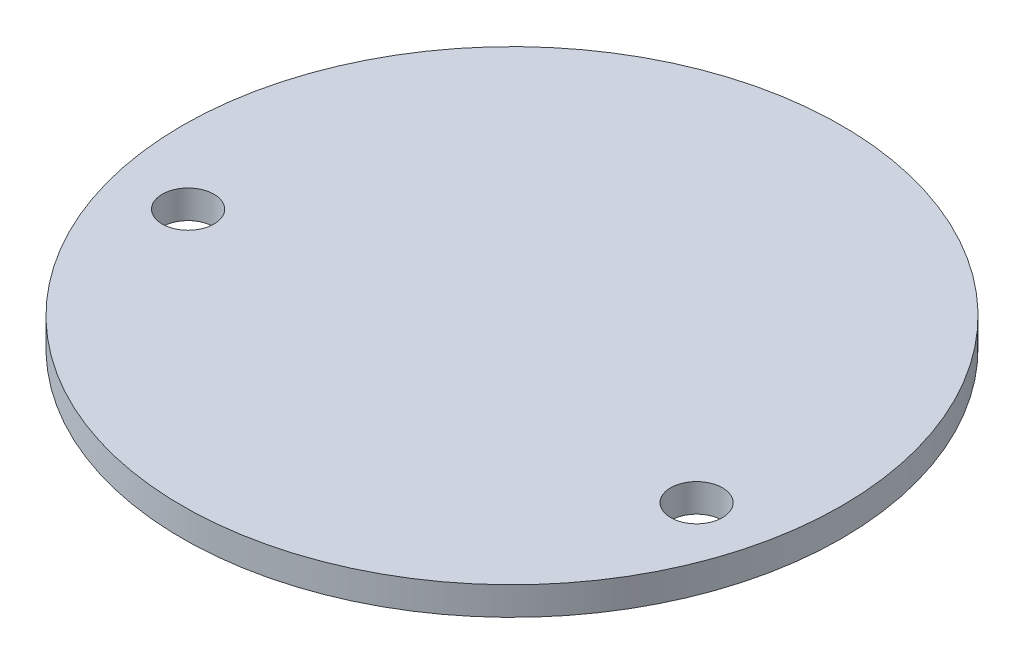
ISO-10303-21;
HEADER;
FILE_DESCRIPTION(('STEP AP214'),'2;1');
FILE_NAME('part.step','',(''),(''),'','','');
FILE_SCHEMA(('AUTOMOTIVE_DESIGN { 1 0 10303 214 1 1 1 1 }'));
ENDSEC;
DATA;
#1=APPLICATION_CONTEXT('core data for automotive mechanical design processes');
#2=APPLICATION_PROTOCOL_DEFINITION('international standard','automotive_design',2000,#1);
#3=PRODUCT_CONTEXT('',#1,'mechanical');
#4=PRODUCT('Part','Part','',(#3));
#5=PRODUCT_RELATED_PRODUCT_CATEGORY('part','',(#4));
#6=PRODUCT_DEFINITION_FORMATION('','',#4);
#7=PRODUCT_DEFINITION_CONTEXT('part definition',#1,'design');
#8=PRODUCT_DEFINITION('design','',#6,#7);
#9=PRODUCT_DEFINITION_SHAPE('','',#8);
#10=(LENGTH_UNIT() NAMED_UNIT(*) SI_UNIT(.MILLI.,.METRE.));
#11=(NAMED_UNIT(*) PLANE_ANGLE_UNIT() SI_UNIT($,.RADIAN.));
#12=(NAMED_UNIT(*) SI_UNIT($,.STERADIAN.) SOLID_ANGLE_UNIT());
#13=UNCERTAINTY_MEASURE_WITH_UNIT(LENGTH_MEASURE(1.E-05),#10,'distance_accuracy_value','');
#14=(GEOMETRIC_REPRESENTATION_CONTEXT(3) GLOBAL_UNCERTAINTY_ASSIGNED_CONTEXT((#13)) GLOBAL_UNIT_ASSIGNED_CONTEXT((#10,
#11,#12)) REPRESENTATION_CONTEXT('',''));
#15=CARTESIAN_POINT('',(0.,0.,0.));
#16=DIRECTION('',(0.,0.,1.));
#17=DIRECTION('',(1.,0.,0.));
#18=AXIS2_PLACEMENT_3D('',#15,#16,#17);
#19=CARTESIAN_POINT('',(0.,0.,0.));
#20=DIRECTION('',(0.,-1.,0.));
#21=DIRECTION('',(1.,0.,0.));
#22=AXIS2_PLACEMENT_3D('',#19,#20,#21);
#23=PLANE('',#22);
#24=CARTESIAN_POINT('',(-27.,-1.52646136765302E-13,7.4));
#25=DIRECTION('',(0.,-1.,0.));
#26=DIRECTION('',(1.,0.,0.));
#27=AXIS2_PLACEMENT_3D('',#24,#25,#26);
#28=CIRCLE('',#27,2.75);
#29=CARTESIAN_POINT('',(-29.75,-1.62079330940637E-13,7.4));
#30=VERTEX_POINT('',#29);
#31=EDGE_CURVE('E58',#30,#30,#28,.F.);
#32=ORIENTED_EDGE('',*,*,#31,.T.);
#33=EDGE_LOOP('',(#32));
#34=FACE_BOUND('',#33,.T.);
#35=CARTESIAN_POINT('',(27.,0.,7.4));
#36=DIRECTION('',(0.,-1.,0.));
#37=DIRECTION('',(1.,0.,0.));
#38=AXIS2_PLACEMENT_3D('',#35,#36,#37);
#39=CIRCLE('',#38,2.75);
#40=CARTESIAN_POINT('',(24.25,0.,7.4));
#41=VERTEX_POINT('',#40);
#42=EDGE_CURVE('E65',#41,#41,#39,.F.);
#43=ORIENTED_EDGE('',*,*,#42,.T.);
#44=EDGE_LOOP('',(#43));
#45=FACE_BOUND('',#44,.T.);
#46=CARTESIAN_POINT('',(0.,-1.11022302462516E-13,0.));
#47=DIRECTION('',(0.,-1.,0.));
#48=DIRECTION('',(1.,0.,0.));
#49=AXIS2_PLACEMENT_3D('',#46,#47,#48);
#50=CIRCLE('',#49,35.);
#51=CARTESIAN_POINT('',(35.,0.,0.));
#52=VERTEX_POINT('',#51);
#53=EDGE_CURVE('E10',#52,#52,#50,.T.);
#54=ORIENTED_EDGE('',*,*,#53,.T.);
#55=EDGE_LOOP('',(#54));
#56=FACE_BOUND('',#55,.T.);
#57=ADVANCED_FACE('F41',(#34,#45,#56),#23,.T.);
#58=CARTESIAN_POINT('',(1.43079862251878E-12,-417.112175525316,0.));
#59=DIRECTION('',(0.,-1.,0.));
#60=DIRECTION('',(1.,0.,0.));
#61=AXIS2_PLACEMENT_3D('',#58,#59,#60);
#62=CYLINDRICAL_SURFACE('',#61,35.);
#63=CARTESIAN_POINT('',(0.,2.99999999999989,0.));
#64=DIRECTION('',(0.,-1.,0.));
#65=DIRECTION('',(1.,0.,0.));
#66=AXIS2_PLACEMENT_3D('',#63,#64,#65);
#67=CIRCLE('',#66,35.);
#68=CARTESIAN_POINT('',(35.,3.00000000000001,0.));
#69=VERTEX_POINT('',#68);
#70=EDGE_CURVE('E48',#69,#69,#67,.T.);
#71=ORIENTED_EDGE('',*,*,#70,.T.);
#72=EDGE_LOOP('',(#71));
#73=FACE_BOUND('',#72,.T.);
#74=ORIENTED_EDGE('',*,*,#53,.F.);
#75=EDGE_LOOP('',(#74));
#76=FACE_BOUND('',#75,.T.);
#77=ADVANCED_FACE('F85',(#73,#76),#62,.T.);
#78=CARTESIAN_POINT('',(35.,3.00000000000006,0.));
#79=DIRECTION('',(0.,1.,0.));
#80=DIRECTION('',(-1.,0.,0.));
#81=AXIS2_PLACEMENT_3D('',#78,#79,#80);
#82=PLANE('',#81);
#83=CARTESIAN_POINT('',(-27.,2.99999999999985,7.4));
#84=DIRECTION('',(0.,1.,0.));
#85=DIRECTION('',(-1.,0.,0.));
#86=AXIS2_PLACEMENT_3D('',#83,#84,#85);
#87=CIRCLE('',#86,2.75);
#88=CARTESIAN_POINT('',(-29.75,2.99999999999984,7.4));
#89=VERTEX_POINT('',#88);
#90=EDGE_CURVE('E53',#89,#89,#87,.T.);
#91=ORIENTED_EDGE('',*,*,#90,.F.);
#92=EDGE_LOOP('',(#91));
#93=FACE_BOUND('',#92,.T.);
#94=CARTESIAN_POINT('',(27.,3.00000000000003,7.4));
#95=DIRECTION('',(0.,1.,0.));
#96=DIRECTION('',(-1.,0.,0.));
#97=AXIS2_PLACEMENT_3D('',#94,#95,#96);
#98=CIRCLE('',#97,2.75);
#99=CARTESIAN_POINT('',(24.25,3.00000000000002,7.4));
#100=VERTEX_POINT('',#99);
#101=EDGE_CURVE('E61',#100,#100,#98,.T.);
#102=ORIENTED_EDGE('',*,*,#101,.F.);
#103=EDGE_LOOP('',(#102));
#104=FACE_BOUND('',#103,.T.);
#105=ORIENTED_EDGE('',*,*,#70,.F.);
#106=EDGE_LOOP('',(#105));
#107=FACE_BOUND('',#106,.T.);
#108=ADVANCED_FACE('F82',(#93,#104,#107),#82,.T.);
#109=CARTESIAN_POINT('',(27.,-0.00100000000001791,7.4));
#110=DIRECTION('',(0.,1.,0.));
#111=DIRECTION('',(-1.,0.,0.));
#112=AXIS2_PLACEMENT_3D('',#109,#110,#111);
#113=CYLINDRICAL_SURFACE('',#112,2.75);
#114=CARTESIAN_POINT('',(24.25,0.,7.4));
#115=CARTESIAN_POINT('',(24.25,0.0312500000000231,7.4));
#116=CARTESIAN_POINT('',(24.25,0.0625000000000231,7.4));
#117=CARTESIAN_POINT('',(24.25,0.125000000000023,7.4));
#118=CARTESIAN_POINT('',(24.25,0.156250000000023,7.4));
#119=CARTESIAN_POINT('',(24.25,0.218750000000023,7.4));
#120=CARTESIAN_POINT('',(24.25,0.250000000000023,7.4));
#121=CARTESIAN_POINT('',(24.25,0.312500000000023,7.4));
#122=CARTESIAN_POINT('',(24.25,0.343750000000023,7.4));
#123=CARTESIAN_POINT('',(24.25,0.406250000000023,7.4));
#124=CARTESIAN_POINT('',(24.25,0.437500000000023,7.4));
#125=CARTESIAN_POINT('',(24.25,0.500000000000023,7.4));
#126=CARTESIAN_POINT('',(24.25,0.531250000000023,7.4));
#127=CARTESIAN_POINT('',(24.25,0.593750000000023,7.4));
#128=CARTESIAN_POINT('',(24.25,0.625000000000023,7.4));
#129=CARTESIAN_POINT('',(24.25,0.687500000000023,7.4));
#130=CARTESIAN_POINT('',(24.25,0.718750000000023,7.4));
#131=CARTESIAN_POINT('',(24.25,0.781250000000023,7.4));
#132=CARTESIAN_POINT('',(24.25,0.812500000000023,7.4));
#133=CARTESIAN_POINT('',(24.25,0.875000000000023,7.4));
#134=CARTESIAN_POINT('',(24.25,0.906250000000023,7.4));
#135=CARTESIAN_POINT('',(24.25,0.968750000000022,7.4));
#136=CARTESIAN_POINT('',(24.25,1.00000000000002,7.4));
#137=CARTESIAN_POINT('',(24.25,1.06250000000002,7.4));
#138=CARTESIAN_POINT('',(24.25,1.09375000000002,7.4));
#139=CARTESIAN_POINT('',(24.25,1.15625000000002,7.4));
#140=CARTESIAN_POINT('',(24.25,1.18750000000002,7.4));
#141=CARTESIAN_POINT('',(24.25,1.25000000000002,7.4));
#142=CARTESIAN_POINT('',(24.25,1.28125000000002,7.4));
#143=CARTESIAN_POINT('',(24.25,1.34375000000002,7.4));
#144=CARTESIAN_POINT('',(24.25,1.37500000000002,7.4));
#145=CARTESIAN_POINT('',(24.25,1.43750000000002,7.4));
#146=CARTESIAN_POINT('',(24.25,1.46875000000002,7.4));
#147=CARTESIAN_POINT('',(24.25,1.53125000000002,7.4));
#148=CARTESIAN_POINT('',(24.25,1.56250000000002,7.4));
#149=CARTESIAN_POINT('',(24.25,1.62500000000002,7.4));
#150=CARTESIAN_POINT('',(24.25,1.65625000000002,7.4));
#151=CARTESIAN_POINT('',(24.25,1.71875000000002,7.4));
#152=CARTESIAN_POINT('',(24.25,1.75000000000002,7.4));
#153=CARTESIAN_POINT('',(24.25,1.81250000000002,7.4));
#154=CARTESIAN_POINT('',(24.25,1.84375000000002,7.4));
#155=CARTESIAN_POINT('',(24.25,1.90625000000002,7.4));
#156=CARTESIAN_POINT('',(24.25,1.93750000000002,7.4));
#157=CARTESIAN_POINT('',(24.25,2.00000000000002,7.4));
#158=CARTESIAN_POINT('',(24.25,2.03125000000002,7.4));
#159=CARTESIAN_POINT('',(24.25,2.09375000000002,7.4));
#160=CARTESIAN_POINT('',(24.25,2.12500000000002,7.4));
#161=CARTESIAN_POINT('',(24.25,2.18750000000002,7.4));
#162=CARTESIAN_POINT('',(24.25,2.21875000000002,7.4));
#163=CARTESIAN_POINT('',(24.25,2.28125000000002,7.4));
#164=CARTESIAN_POINT('',(24.25,2.31250000000002,7.4));
#165=CARTESIAN_POINT('',(24.25,2.37500000000002,7.4));
#166=CARTESIAN_POINT('',(24.25,2.40625000000002,7.4));
#167=CARTESIAN_POINT('',(24.25,2.46875000000002,7.4));
#168=CARTESIAN_POINT('',(24.25,2.50000000000002,7.4));
#169=CARTESIAN_POINT('',(24.25,2.56250000000002,7.4));
#170=CARTESIAN_POINT('',(24.25,2.59375000000002,7.4));
#171=CARTESIAN_POINT('',(24.25,2.65625000000002,7.4));
#172=CARTESIAN_POINT('',(24.25,2.68750000000002,7.4));
#173=CARTESIAN_POINT('',(24.25,2.75000000000002,7.4));
#174=CARTESIAN_POINT('',(24.25,2.78125000000002,7.4));
#175=CARTESIAN_POINT('',(24.25,2.84375000000002,7.4));
#176=CARTESIAN_POINT('',(24.25,2.87500000000002,7.4));
#177=CARTESIAN_POINT('',(24.25,2.93750000000002,7.4));
#178=CARTESIAN_POINT('',(24.25,2.96875000000002,7.4));
#179=CARTESIAN_POINT('',(24.25,3.00000000000002,7.4));
#180=B_SPLINE_CURVE_WITH_KNOTS('',3,(#114,#115,#116,#117,#118,#119,#120,#121,#122,#123,#124,
#125,#126,#127,#128,#129,#130,#131,#132,#133,#134,#135,#136,#137,#138,#139,#140,#141,#142,#143,
#144,#145,#146,#147,#148,#149,#150,#151,#152,#153,#154,#155,#156,#157,#158,#159,#160,#161,#162,
#163,#164,#165,#166,#167,#168,#169,#170,#171,#172,#173,#174,#175,#176,#177,#178,#179),
.UNSPECIFIED.,.F.,.F.,(4,2,2,2,2,2,2,2,2,2,2,2,2,2,2,2,2,2,2,2,2,2,2,2,2,2,2,2,2,2,2,2,4),(0.,
0.0937499999999999,0.1875,0.28125,0.375,0.46875,0.5625,0.65625,0.75,0.84375,0.9375,1.03125,
1.125,1.21875,1.3125,1.40625,1.5,1.59375,1.6875,1.78125,1.875,1.96875,2.0625,2.15625,2.25,
2.34375,2.4375,2.53125,2.625,2.71875,2.8125,2.90625,3.),.UNSPECIFIED.);
#181=EDGE_CURVE('BSEAM78',#41,#100,#180,.T.);
#182=ORIENTED_EDGE('',*,*,#42,.F.);
#183=ORIENTED_EDGE('',*,*,#101,.T.);
#184=ORIENTED_EDGE('',*,*,#181,.T.);
#185=ORIENTED_EDGE('',*,*,#181,.F.);
#186=EDGE_LOOP('',(#182,#184,#183,#185));
#187=FACE_BOUND('',#186,.T.);
#188=ADVANCED_FACE('F78',(#187),#113,.F.);
#189=CARTESIAN_POINT('',(-27.,-0.00100000000020353,7.4));
#190=DIRECTION('',(0.,1.,0.));
#191=DIRECTION('',(-1.,0.,0.));
#192=AXIS2_PLACEMENT_3D('',#189,#190,#191);
#193=CYLINDRICAL_SURFACE('',#192,2.75);
#194=CARTESIAN_POINT('',(-29.75,-1.62079330940637E-13,7.4));
#195=CARTESIAN_POINT('',(-29.75,0.0312499999998379,7.4));
#196=CARTESIAN_POINT('',(-29.75,0.0624999999998379,7.4));
#197=CARTESIAN_POINT('',(-29.75,0.124999999999838,7.4));
#198=CARTESIAN_POINT('',(-29.75,0.156249999999838,7.4));
#199=CARTESIAN_POINT('',(-29.75,0.218749999999838,7.4));
#200=CARTESIAN_POINT('',(-29.75,0.249999999999838,7.4));
#201=CARTESIAN_POINT('',(-29.75,0.312499999999838,7.4));
#202=CARTESIAN_POINT('',(-29.75,0.343749999999838,7.4));
#203=CARTESIAN_POINT('',(-29.75,0.406249999999838,7.4));
#204=CARTESIAN_POINT('',(-29.75,0.437499999999838,7.4));
#205=CARTESIAN_POINT('',(-29.75,0.499999999999837,7.4));
#206=CARTESIAN_POINT('',(-29.75,0.531249999999837,7.4));
#207=CARTESIAN_POINT('',(-29.75,0.593749999999837,7.4));
#208=CARTESIAN_POINT('',(-29.75,0.624999999999837,7.4));
#209=CARTESIAN_POINT('',(-29.75,0.687499999999837,7.4));
#210=CARTESIAN_POINT('',(-29.75,0.718749999999837,7.4));
#211=CARTESIAN_POINT('',(-29.75,0.781249999999837,7.4));
#212=CARTESIAN_POINT('',(-29.75,0.812499999999837,7.4));
#213=CARTESIAN_POINT('',(-29.75,0.874999999999837,7.4));
#214=CARTESIAN_POINT('',(-29.75,0.906249999999837,7.4));
#215=CARTESIAN_POINT('',(-29.75,0.968749999999837,7.4));
#216=CARTESIAN_POINT('',(-29.75,0.999999999999837,7.4));
#217=CARTESIAN_POINT('',(-29.75,1.06249999999984,7.4));
#218=CARTESIAN_POINT('',(-29.75,1.09374999999984,7.4));
#219=CARTESIAN_POINT('',(-29.75,1.15624999999984,7.4));
#220=CARTESIAN_POINT('',(-29.75,1.18749999999984,7.4));
#221=CARTESIAN_POINT('',(-29.75,1.24999999999984,7.4));
#222=CARTESIAN_POINT('',(-29.75,1.28124999999984,7.4));
#223=CARTESIAN_POINT('',(-29.75,1.34374999999984,7.4));
#224=CARTESIAN_POINT('',(-29.75,1.37499999999984,7.4));
#225=CARTESIAN_POINT('',(-29.75,1.43749999999984,7.4));
#226=CARTESIAN_POINT('',(-29.75,1.46874999999984,7.4));
#227=CARTESIAN_POINT('',(-29.75,1.53124999999984,7.4));
#228=CARTESIAN_POINT('',(-29.75,1.56249999999984,7.4));
#229=CARTESIAN_POINT('',(-29.75,1.62499999999984,7.4));
#230=CARTESIAN_POINT('',(-29.75,1.65624999999984,7.4));
#231=CARTESIAN_POINT('',(-29.75,1.71874999999984,7.4));
#232=CARTESIAN_POINT('',(-29.75,1.74999999999984,7.4));
#233=CARTESIAN_POINT('',(-29.75,1.81249999999984,7.4));
#234=CARTESIAN_POINT('',(-29.75,1.84374999999984,7.4));
#235=CARTESIAN_POINT('',(-29.75,1.90624999999984,7.4));
#236=CARTESIAN_POINT('',(-29.75,1.93749999999984,7.4));
#237=CARTESIAN_POINT('',(-29.75,1.99999999999984,7.4));
#238=CARTESIAN_POINT('',(-29.75,2.03124999999984,7.4));
#239=CARTESIAN_POINT('',(-29.75,2.09374999999984,7.4));
#240=CARTESIAN_POINT('',(-29.75,2.12499999999984,7.4));
#241=CARTESIAN_POINT('',(-29.75,2.18749999999984,7.4));
#242=CARTESIAN_POINT('',(-29.75,2.21874999999984,7.4));
#243=CARTESIAN_POINT('',(-29.75,2.28124999999984,7.4));
#244=CARTESIAN_POINT('',(-29.75,2.31249999999984,7.4));
#245=CARTESIAN_POINT('',(-29.75,2.37499999999984,7.4));
#246=CARTESIAN_POINT('',(-29.75,2.40624999999984,7.4));
#247=CARTESIAN_POINT('',(-29.75,2.46874999999984,7.4));
#248=CARTESIAN_POINT('',(-29.75,2.49999999999984,7.4));
#249=CARTESIAN_POINT('',(-29.75,2.56249999999984,7.4));
#250=CARTESIAN_POINT('',(-29.75,2.59374999999984,7.4));
#251=CARTESIAN_POINT('',(-29.75,2.65624999999984,7.4));
#252=CARTESIAN_POINT('',(-29.75,2.68749999999984,7.4));
#253=CARTESIAN_POINT('',(-29.75,2.74999999999984,7.4));
#254=CARTESIAN_POINT('',(-29.75,2.78124999999984,7.4));
#255=CARTESIAN_POINT('',(-29.75,2.84374999999984,7.4));
#256=CARTESIAN_POINT('',(-29.75,2.87499999999984,7.4));
#257=CARTESIAN_POINT('',(-29.75,2.93749999999984,7.4));
#258=CARTESIAN_POINT('',(-29.75,2.96874999999984,7.4));
#259=CARTESIAN_POINT('',(-29.75,2.99999999999984,7.4));
#260=B_SPLINE_CURVE_WITH_KNOTS('',3,(#194,#195,#196,#197,#198,#199,#200,#201,#202,#203,#204,
#205,#206,#207,#208,#209,#210,#211,#212,#213,#214,#215,#216,#217,#218,#219,#220,#221,#222,#223,
#224,#225,#226,#227,#228,#229,#230,#231,#232,#233,#234,#235,#236,#237,#238,#239,#240,#241,#242,
#243,#244,#245,#246,#247,#248,#249,#250,#251,#252,#253,#254,#255,#256,#257,#258,#259),
.UNSPECIFIED.,.F.,.F.,(4,2,2,2,2,2,2,2,2,2,2,2,2,2,2,2,2,2,2,2,2,2,2,2,2,2,2,2,2,2,2,2,4),(0.,
0.0937499999999999,0.1875,0.28125,0.375,0.46875,0.5625,0.656249999999999,0.749999999999999,
0.843749999999999,0.937499999999999,1.03125,1.125,1.21875,1.3125,1.40625,1.5,1.59375,1.6875,
1.78125,1.875,1.96875,2.0625,2.15625,2.25,2.34375,2.4375,2.53125,2.625,2.71875,2.8125,2.90625,
3.),.UNSPECIFIED.);
#261=EDGE_CURVE('BSEAM75',#30,#89,#260,.T.);
#262=ORIENTED_EDGE('',*,*,#31,.F.);
#263=ORIENTED_EDGE('',*,*,#90,.T.);
#264=ORIENTED_EDGE('',*,*,#261,.T.);
#265=ORIENTED_EDGE('',*,*,#261,.F.);
#266=EDGE_LOOP('',(#262,#264,#263,#265));
#267=FACE_BOUND('',#266,.T.);
#268=ADVANCED_FACE('F75',(#267),#193,.F.);
#269=CLOSED_SHELL('',(#57,#77,#108,#188,#268));
#270=MANIFOLD_SOLID_BREP('B2',#269);
#271=ADVANCED_BREP_SHAPE_REPRESENTATION('',(#18,#270),#14);
#272=SHAPE_DEFINITION_REPRESENTATION(#9,#271);
ENDSEC;
END-ISO-10303-21;
